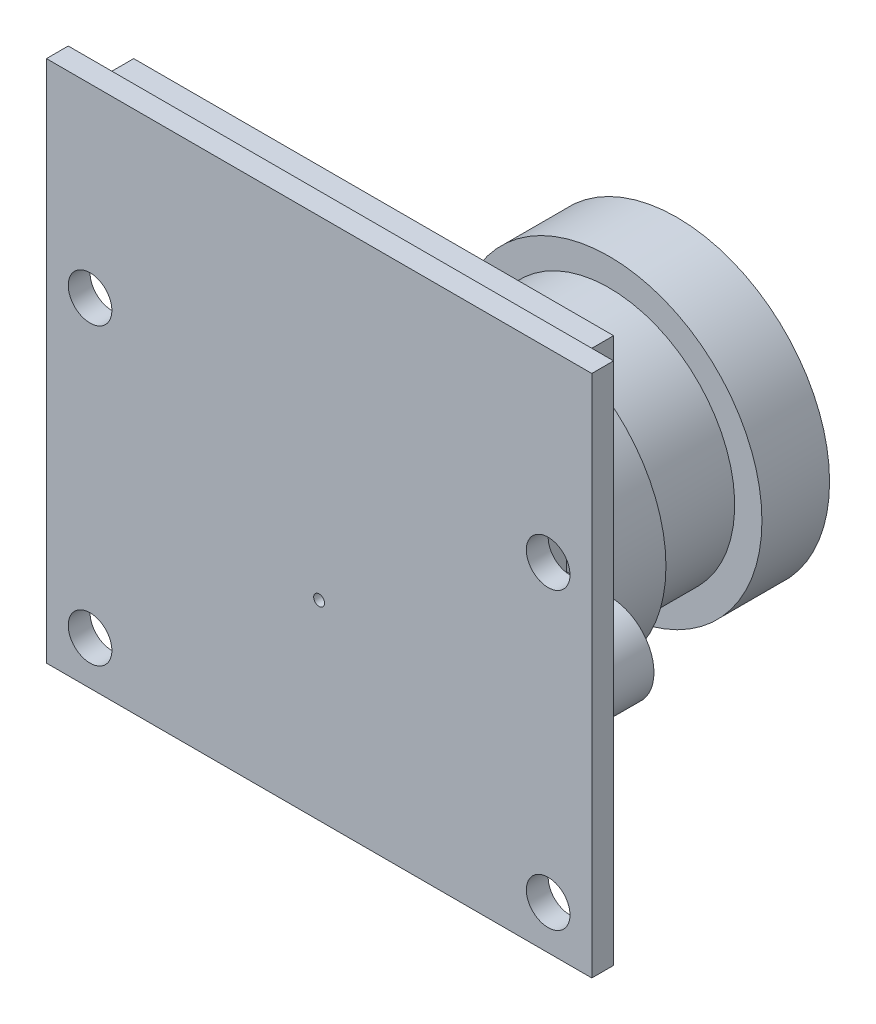
ISO-10303-21;
HEADER;
FILE_DESCRIPTION(('STEP AP214'),'2;1');
FILE_NAME('part.step','',(''),(''),'','','');
FILE_SCHEMA(('AUTOMOTIVE_DESIGN { 1 0 10303 214 1 1 1 1 }'));
ENDSEC;
DATA;
#1=APPLICATION_CONTEXT('core data for automotive mechanical design processes');
#2=APPLICATION_PROTOCOL_DEFINITION('international standard','automotive_design',2000,#1);
#3=PRODUCT_CONTEXT('',#1,'mechanical');
#4=PRODUCT('Part','Part','',(#3));
#5=PRODUCT_RELATED_PRODUCT_CATEGORY('part','',(#4));
#6=PRODUCT_DEFINITION_FORMATION('','',#4);
#7=PRODUCT_DEFINITION_CONTEXT('part definition',#1,'design');
#8=PRODUCT_DEFINITION('design','',#6,#7);
#9=PRODUCT_DEFINITION_SHAPE('','',#8);
#10=(LENGTH_UNIT() NAMED_UNIT(*) SI_UNIT(.MILLI.,.METRE.));
#11=(NAMED_UNIT(*) PLANE_ANGLE_UNIT() SI_UNIT($,.RADIAN.));
#12=(NAMED_UNIT(*) SI_UNIT($,.STERADIAN.) SOLID_ANGLE_UNIT());
#13=UNCERTAINTY_MEASURE_WITH_UNIT(LENGTH_MEASURE(1.E-05),#10,'distance_accuracy_value','');
#14=(GEOMETRIC_REPRESENTATION_CONTEXT(3) GLOBAL_UNCERTAINTY_ASSIGNED_CONTEXT((#13)) GLOBAL_UNIT_ASSIGNED_CONTEXT((#10,
#11,#12)) REPRESENTATION_CONTEXT('',''));
#15=CARTESIAN_POINT('',(0.,0.,0.));
#16=DIRECTION('',(0.,0.,1.));
#17=DIRECTION('',(1.,0.,0.));
#18=AXIS2_PLACEMENT_3D('',#15,#16,#17);
#19=CARTESIAN_POINT('',(3.94999511703025,8.74999999998993,-4.8));
#20=DIRECTION('',(0.,0.,1.));
#21=DIRECTION('',(1.,0.,0.));
#22=AXIS2_PLACEMENT_3D('',#19,#20,#21);
#23=PLANE('',#22);
#24=CARTESIAN_POINT('',(12.5,8.75,-4.8));
#25=DIRECTION('',(0.,0.,-1.));
#26=DIRECTION('',(-1.,0.,0.));
#27=AXIS2_PLACEMENT_3D('',#24,#25,#26);
#28=CIRCLE('',#27,6.6);
#29=CARTESIAN_POINT('',(13.3108637371741,15.2999999999798,-4.8));
#30=VERTEX_POINT('',#29);
#31=CARTESIAN_POINT('',(13.3108637368486,2.19999999997985,-4.8));
#32=VERTEX_POINT('',#31);
#33=EDGE_CURVE('E11',#30,#32,#28,.T.);
#34=ORIENTED_EDGE('',*,*,#33,.F.);
#35=DIRECTION('',(1.,0.,0.));
#36=VECTOR('',#35,1.);
#37=CARTESIAN_POINT('',(19.05,15.2999999999799,-4.8));
#38=LINE('',#37,#36);
#39=CARTESIAN_POINT('',(19.05,15.2999999999799,-4.8));
#40=VERTEX_POINT('',#39);
#41=EDGE_CURVE('E193',#30,#40,#38,.T.);
#42=ORIENTED_EDGE('',*,*,#41,.T.);
#43=DIRECTION('',(0.,-1.,0.));
#44=VECTOR('',#43,1.);
#45=CARTESIAN_POINT('',(19.05,10.75,-4.8));
#46=LINE('',#45,#44);
#47=CARTESIAN_POINT('',(19.05,10.75,-4.8));
#48=VERTEX_POINT('',#47);
#49=EDGE_CURVE('E190',#40,#48,#46,.T.);
#50=ORIENTED_EDGE('',*,*,#49,.T.);
#51=DIRECTION('',(1.,0.,0.));
#52=VECTOR('',#51,1.);
#53=CARTESIAN_POINT('',(21.0500097660236,10.75,-4.8));
#54=LINE('',#53,#52);
#55=CARTESIAN_POINT('',(21.0500097660236,10.75,-4.8));
#56=VERTEX_POINT('',#55);
#57=EDGE_CURVE('E246',#48,#56,#54,.T.);
#58=ORIENTED_EDGE('',*,*,#57,.T.);
#59=CARTESIAN_POINT('',(21.0500097660236,8.74999999998993,-4.8));
#60=DIRECTION('',(0.,0.,-1.));
#61=DIRECTION('',(1.,0.,0.));
#62=AXIS2_PLACEMENT_3D('',#59,#60,#61);
#63=CIRCLE('',#62,2.00000000001008);
#64=CARTESIAN_POINT('',(21.0500097660236,6.74999999997985,-4.8));
#65=VERTEX_POINT('',#64);
#66=EDGE_CURVE('E248',#56,#65,#63,.T.);
#67=ORIENTED_EDGE('',*,*,#66,.T.);
#68=DIRECTION('',(-1.,0.,0.));
#69=VECTOR('',#68,1.);
#70=CARTESIAN_POINT('',(19.05,6.74999999997985,-4.8));
#71=LINE('',#70,#69);
#72=CARTESIAN_POINT('',(19.05,6.74999999997985,-4.8));
#73=VERTEX_POINT('',#72);
#74=EDGE_CURVE('E250',#65,#73,#71,.T.);
#75=ORIENTED_EDGE('',*,*,#74,.T.);
#76=DIRECTION('',(0.,-1.,0.));
#77=VECTOR('',#76,1.);
#78=CARTESIAN_POINT('',(19.05,2.19999999997985,-4.8));
#79=LINE('',#78,#77);
#80=CARTESIAN_POINT('',(19.05,2.19999999997985,-4.8));
#81=VERTEX_POINT('',#80);
#82=EDGE_CURVE('E252',#73,#81,#79,.T.);
#83=ORIENTED_EDGE('',*,*,#82,.T.);
#84=DIRECTION('',(-1.,0.,0.));
#85=VECTOR('',#84,1.);
#86=CARTESIAN_POINT('',(5.95,2.19999999997985,-4.8));
#87=LINE('',#86,#85);
#88=EDGE_CURVE('E255',#81,#32,#87,.T.);
#89=ORIENTED_EDGE('',*,*,#88,.T.);
#90=EDGE_LOOP('',(#34,#42,#50,#58,#67,#75,#83,#89));
#91=FACE_BOUND('',#90,.T.);
#92=ADVANCED_FACE('F33',(#91),#23,.F.);
#93=CARTESIAN_POINT('',(0.,0.,-1.));
#94=DIRECTION('',(0.,0.,-1.));
#95=DIRECTION('',(-1.,0.,0.));
#96=AXIS2_PLACEMENT_3D('',#93,#94,#95);
#97=PLANE('',#96);
#98=CARTESIAN_POINT('',(2.,2.,-1.));
#99=DIRECTION('',(0.,0.,-1.));
#100=DIRECTION('',(-1.,0.,0.));
#101=AXIS2_PLACEMENT_3D('',#98,#99,#100);
#102=CIRCLE('',#101,0.999999999999986);
#103=CARTESIAN_POINT('',(1.00000000000001,2.,-1.));
#104=VERTEX_POINT('',#103);
#105=EDGE_CURVE('E777',#104,#104,#102,.T.);
#106=ORIENTED_EDGE('',*,*,#105,.F.);
#107=EDGE_LOOP('',(#106));
#108=FACE_BOUND('',#107,.T.);
#109=CARTESIAN_POINT('',(2.,15.5,-1.));
#110=DIRECTION('',(0.,0.,-1.));
#111=DIRECTION('',(-1.,0.,0.));
#112=AXIS2_PLACEMENT_3D('',#109,#110,#111);
#113=CIRCLE('',#112,0.999999999999986);
#114=CARTESIAN_POINT('',(1.00000000000001,15.5,-1.));
#115=VERTEX_POINT('',#114);
#116=EDGE_CURVE('E37',#115,#115,#113,.T.);
#117=ORIENTED_EDGE('',*,*,#116,.F.);
#118=EDGE_LOOP('',(#117));
#119=FACE_BOUND('',#118,.T.);
#120=CARTESIAN_POINT('',(23.,15.5,-1.));
#121=DIRECTION('',(0.,0.,-1.));
#122=DIRECTION('',(-1.,0.,0.));
#123=AXIS2_PLACEMENT_3D('',#120,#121,#122);
#124=CIRCLE('',#123,0.999999999999987);
#125=CARTESIAN_POINT('',(22.,15.5,-1.));
#126=VERTEX_POINT('',#125);
#127=EDGE_CURVE('E353',#126,#126,#124,.T.);
#128=ORIENTED_EDGE('',*,*,#127,.F.);
#129=EDGE_LOOP('',(#128));
#130=FACE_BOUND('',#129,.T.);
#131=CARTESIAN_POINT('',(23.,2.,-1.));
#132=DIRECTION('',(0.,0.,-1.));
#133=DIRECTION('',(-1.,0.,0.));
#134=AXIS2_PLACEMENT_3D('',#131,#132,#133);
#135=CIRCLE('',#134,0.999999999999987);
#136=CARTESIAN_POINT('',(22.,2.,-1.));
#137=VERTEX_POINT('',#136);
#138=EDGE_CURVE('E360',#137,#137,#135,.T.);
#139=ORIENTED_EDGE('',*,*,#138,.F.);
#140=EDGE_LOOP('',(#139));
#141=FACE_BOUND('',#140,.T.);
#142=DIRECTION('',(0.,-1.,0.));
#143=VECTOR('',#142,1.);
#144=CARTESIAN_POINT('',(25.,24.,-1.));
#145=LINE('',#144,#143);
#146=CARTESIAN_POINT('',(25.,24.,-1.));
#147=VERTEX_POINT('',#146);
#148=CARTESIAN_POINT('',(25.,0.,-1.));
#149=VERTEX_POINT('',#148);
#150=EDGE_CURVE('E323',#147,#149,#145,.T.);
#151=ORIENTED_EDGE('',*,*,#150,.T.);
#152=DIRECTION('',(-1.,0.,0.));
#153=VECTOR('',#152,1.);
#154=CARTESIAN_POINT('',(25.,0.,-1.));
#155=LINE('',#154,#153);
#156=CARTESIAN_POINT('',(0.,0.,-1.));
#157=VERTEX_POINT('',#156);
#158=EDGE_CURVE('E340',#149,#157,#155,.T.);
#159=ORIENTED_EDGE('',*,*,#158,.T.);
#160=DIRECTION('',(0.,1.,0.));
#161=VECTOR('',#160,1.);
#162=CARTESIAN_POINT('',(0.,0.,-1.));
#163=LINE('',#162,#161);
#164=CARTESIAN_POINT('',(0.,24.,-1.));
#165=VERTEX_POINT('',#164);
#166=EDGE_CURVE('E343',#157,#165,#163,.T.);
#167=ORIENTED_EDGE('',*,*,#166,.T.);
#168=DIRECTION('',(1.,0.,0.));
#169=VECTOR('',#168,1.);
#170=CARTESIAN_POINT('',(0.,24.,-1.));
#171=LINE('',#170,#169);
#172=EDGE_CURVE('E328',#165,#147,#171,.T.);
#173=ORIENTED_EDGE('',*,*,#172,.T.);
#174=EDGE_LOOP('',(#151,#159,#167,#173));
#175=FACE_BOUND('',#174,.T.);
#176=DIRECTION('',(1.,0.,0.));
#177=VECTOR('',#176,1.);
#178=CARTESIAN_POINT('',(19.05,15.2999999999799,-1.));
#179=LINE('',#178,#177);
#180=CARTESIAN_POINT('',(5.95,15.2999999999799,-1.));
#181=VERTEX_POINT('',#180);
#182=CARTESIAN_POINT('',(19.05,15.2999999999799,-1.));
#183=VERTEX_POINT('',#182);
#184=EDGE_CURVE('E268',#181,#183,#179,.T.);
#185=ORIENTED_EDGE('',*,*,#184,.F.);
#186=DIRECTION('',(0.,1.,0.));
#187=VECTOR('',#186,1.);
#188=CARTESIAN_POINT('',(5.95,15.2999999999799,-1.));
#189=LINE('',#188,#187);
#190=CARTESIAN_POINT('',(5.95,10.75,-1.));
#191=VERTEX_POINT('',#190);
#192=EDGE_CURVE('E242',#191,#181,#189,.T.);
#193=ORIENTED_EDGE('',*,*,#192,.F.);
#194=DIRECTION('',(1.,0.,0.));
#195=VECTOR('',#194,1.);
#196=CARTESIAN_POINT('',(5.95,10.75,-1.));
#197=LINE('',#196,#195);
#198=CARTESIAN_POINT('',(3.94999511703025,10.75,-1.));
#199=VERTEX_POINT('',#198);
#200=EDGE_CURVE('E243',#199,#191,#197,.T.);
#201=ORIENTED_EDGE('',*,*,#200,.F.);
#202=CARTESIAN_POINT('',(3.94999511703025,8.74999999998993,-1.));
#203=DIRECTION('',(0.,0.,-1.));
#204=DIRECTION('',(1.,0.,0.));
#205=AXIS2_PLACEMENT_3D('',#202,#203,#204);
#206=CIRCLE('',#205,2.00000000001007);
#207=CARTESIAN_POINT('',(3.94999511703025,6.74999999997985,-1.));
#208=VERTEX_POINT('',#207);
#209=EDGE_CURVE('E286',#208,#199,#206,.T.);
#210=ORIENTED_EDGE('',*,*,#209,.F.);
#211=DIRECTION('',(-1.,0.,0.));
#212=VECTOR('',#211,1.);
#213=CARTESIAN_POINT('',(3.94999511703025,6.74999999997985,-1.));
#214=LINE('',#213,#212);
#215=CARTESIAN_POINT('',(5.95,6.74999999997985,-1.));
#216=VERTEX_POINT('',#215);
#217=EDGE_CURVE('E284',#216,#208,#214,.T.);
#218=ORIENTED_EDGE('',*,*,#217,.F.);
#219=DIRECTION('',(0.,1.,0.));
#220=VECTOR('',#219,1.);
#221=CARTESIAN_POINT('',(5.95,6.74999999997985,-1.));
#222=LINE('',#221,#220);
#223=CARTESIAN_POINT('',(5.95,2.19999999997985,-1.));
#224=VERTEX_POINT('',#223);
#225=EDGE_CURVE('E282',#224,#216,#222,.T.);
#226=ORIENTED_EDGE('',*,*,#225,.F.);
#227=DIRECTION('',(-1.,0.,0.));
#228=VECTOR('',#227,1.);
#229=CARTESIAN_POINT('',(5.95,2.19999999997985,-1.));
#230=LINE('',#229,#228);
#231=CARTESIAN_POINT('',(19.05,2.19999999997985,-1.));
#232=VERTEX_POINT('',#231);
#233=EDGE_CURVE('E280',#232,#224,#230,.T.);
#234=ORIENTED_EDGE('',*,*,#233,.F.);
#235=DIRECTION('',(0.,-1.,0.));
#236=VECTOR('',#235,1.);
#237=CARTESIAN_POINT('',(19.05,2.19999999997985,-1.));
#238=LINE('',#237,#236);
#239=CARTESIAN_POINT('',(19.05,6.74999999997985,-1.));
#240=VERTEX_POINT('',#239);
#241=EDGE_CURVE('E278',#240,#232,#238,.T.);
#242=ORIENTED_EDGE('',*,*,#241,.F.);
#243=DIRECTION('',(-1.,0.,0.));
#244=VECTOR('',#243,1.);
#245=CARTESIAN_POINT('',(19.05,6.74999999997985,-1.));
#246=LINE('',#245,#244);
#247=CARTESIAN_POINT('',(21.0500097660236,6.74999999997985,-1.));
#248=VERTEX_POINT('',#247);
#249=EDGE_CURVE('E276',#248,#240,#246,.T.);
#250=ORIENTED_EDGE('',*,*,#249,.F.);
#251=CARTESIAN_POINT('',(21.0500097660236,8.74999999998993,-1.));
#252=DIRECTION('',(0.,0.,-1.));
#253=DIRECTION('',(1.,0.,0.));
#254=AXIS2_PLACEMENT_3D('',#251,#252,#253);
#255=CIRCLE('',#254,2.00000000001008);
#256=CARTESIAN_POINT('',(21.0500097660236,10.75,-1.));
#257=VERTEX_POINT('',#256);
#258=EDGE_CURVE('E274',#257,#248,#255,.T.);
#259=ORIENTED_EDGE('',*,*,#258,.F.);
#260=DIRECTION('',(1.,0.,0.));
#261=VECTOR('',#260,1.);
#262=CARTESIAN_POINT('',(21.0500097660236,10.75,-1.));
#263=LINE('',#262,#261);
#264=CARTESIAN_POINT('',(19.05,10.75,-1.));
#265=VERTEX_POINT('',#264);
#266=EDGE_CURVE('E272',#265,#257,#263,.T.);
#267=ORIENTED_EDGE('',*,*,#266,.F.);
#268=DIRECTION('',(0.,-1.,0.));
#269=VECTOR('',#268,1.);
#270=CARTESIAN_POINT('',(19.05,10.75,-1.));
#271=LINE('',#270,#269);
#272=EDGE_CURVE('E270',#183,#265,#271,.T.);
#273=ORIENTED_EDGE('',*,*,#272,.F.);
#274=EDGE_LOOP('',(#185,#193,#201,#210,#218,#226,#234,#242,#250,#259,#267,#273));
#275=FACE_BOUND('',#274,.T.);
#276=DIRECTION('',(0.,1.,0.));
#277=VECTOR('',#276,1.);
#278=CARTESIAN_POINT('',(1.5,23.5,-1.));
#279=LINE('',#278,#277);
#280=CARTESIAN_POINT('',(1.5,18.6977042974412,-1.));
#281=VERTEX_POINT('',#280);
#282=CARTESIAN_POINT('',(1.5,23.5,-1.));
#283=VERTEX_POINT('',#282);
#284=EDGE_CURVE('E211',#281,#283,#279,.T.);
#285=ORIENTED_EDGE('',*,*,#284,.F.);
#286=DIRECTION('',(-1.,0.,0.));
#287=VECTOR('',#286,1.);
#288=CARTESIAN_POINT('',(1.5,18.6977042974412,-1.));
#289=LINE('',#288,#287);
#290=CARTESIAN_POINT('',(23.5,18.6977042974412,-1.));
#291=VERTEX_POINT('',#290);
#292=EDGE_CURVE('E209',#291,#281,#289,.T.);
#293=ORIENTED_EDGE('',*,*,#292,.F.);
#294=DIRECTION('',(0.,-1.,0.));
#295=VECTOR('',#294,1.);
#296=CARTESIAN_POINT('',(23.5,18.6977042974412,-1.));
#297=LINE('',#296,#295);
#298=CARTESIAN_POINT('',(23.5,23.5,-1.));
#299=VERTEX_POINT('',#298);
#300=EDGE_CURVE('E221',#299,#291,#297,.T.);
#301=ORIENTED_EDGE('',*,*,#300,.F.);
#302=DIRECTION('',(1.,0.,0.));
#303=VECTOR('',#302,1.);
#304=CARTESIAN_POINT('',(23.5,23.5,-1.));
#305=LINE('',#304,#303);
#306=EDGE_CURVE('E229',#283,#299,#305,.T.);
#307=ORIENTED_EDGE('',*,*,#306,.F.);
#308=EDGE_LOOP('',(#285,#293,#301,#307));
#309=FACE_BOUND('',#308,.T.);
#310=ADVANCED_FACE('F410',(#108,#119,#130,#141,#175,#275,#309),#97,.T.);
#311=CARTESIAN_POINT('',(25.,24.,0.));
#312=DIRECTION('',(1.,0.,0.));
#313=DIRECTION('',(0.,0.,-1.));
#314=AXIS2_PLACEMENT_3D('',#311,#312,#313);
#315=PLANE('',#314);
#316=ORIENTED_EDGE('',*,*,#150,.F.);
#317=DIRECTION('',(0.,0.,-1.));
#318=VECTOR('',#317,1.);
#319=CARTESIAN_POINT('',(25.,24.,0.));
#320=LINE('',#319,#318);
#321=CARTESIAN_POINT('',(25.,24.,0.));
#322=VERTEX_POINT('',#321);
#323=EDGE_CURVE('E207',#322,#147,#320,.T.);
#324=ORIENTED_EDGE('',*,*,#323,.F.);
#325=DIRECTION('',(0.,-1.,0.));
#326=VECTOR('',#325,1.);
#327=CARTESIAN_POINT('',(25.,24.,0.));
#328=LINE('',#327,#326);
#329=CARTESIAN_POINT('',(25.,0.,0.));
#330=VERTEX_POINT('',#329);
#331=EDGE_CURVE('E324',#322,#330,#328,.T.);
#332=ORIENTED_EDGE('',*,*,#331,.T.);
#333=DIRECTION('',(0.,0.,-1.));
#334=VECTOR('',#333,1.);
#335=CARTESIAN_POINT('',(25.,0.,0.));
#336=LINE('',#335,#334);
#337=EDGE_CURVE('E337',#330,#149,#336,.T.);
#338=ORIENTED_EDGE('',*,*,#337,.T.);
#339=EDGE_LOOP('',(#316,#324,#332,#338));
#340=FACE_BOUND('',#339,.T.);
#341=ADVANCED_FACE('F35',(#340),#315,.T.);
#342=CARTESIAN_POINT('',(0.,24.,0.));
#343=DIRECTION('',(0.,1.,0.));
#344=DIRECTION('',(0.,0.,1.));
#345=AXIS2_PLACEMENT_3D('',#342,#343,#344);
#346=PLANE('',#345);
#347=ORIENTED_EDGE('',*,*,#172,.F.);
#348=DIRECTION('',(0.,0.,-1.));
#349=VECTOR('',#348,1.);
#350=CARTESIAN_POINT('',(0.,24.,0.));
#351=LINE('',#350,#349);
#352=CARTESIAN_POINT('',(0.,24.,0.));
#353=VERTEX_POINT('',#352);
#354=EDGE_CURVE('E349',#353,#165,#351,.T.);
#355=ORIENTED_EDGE('',*,*,#354,.F.);
#356=DIRECTION('',(1.,0.,0.));
#357=VECTOR('',#356,1.);
#358=CARTESIAN_POINT('',(0.,24.,0.));
#359=LINE('',#358,#357);
#360=EDGE_CURVE('E334',#353,#322,#359,.T.);
#361=ORIENTED_EDGE('',*,*,#360,.T.);
#362=ORIENTED_EDGE('',*,*,#323,.T.);
#363=EDGE_LOOP('',(#347,#355,#361,#362));
#364=FACE_BOUND('',#363,.T.);
#365=ADVANCED_FACE('F479',(#364),#346,.T.);
#366=CARTESIAN_POINT('',(0.,0.,0.));
#367=DIRECTION('',(-1.,0.,0.));
#368=DIRECTION('',(0.,0.,1.));
#369=AXIS2_PLACEMENT_3D('',#366,#367,#368);
#370=PLANE('',#369);
#371=ORIENTED_EDGE('',*,*,#166,.F.);
#372=DIRECTION('',(0.,0.,-1.));
#373=VECTOR('',#372,1.);
#374=CARTESIAN_POINT('',(0.,0.,0.));
#375=LINE('',#374,#373);
#376=CARTESIAN_POINT('',(0.,0.,0.));
#377=VERTEX_POINT('',#376);
#378=EDGE_CURVE('E351',#377,#157,#375,.T.);
#379=ORIENTED_EDGE('',*,*,#378,.F.);
#380=DIRECTION('',(0.,1.,0.));
#381=VECTOR('',#380,1.);
#382=CARTESIAN_POINT('',(0.,0.,0.));
#383=LINE('',#382,#381);
#384=EDGE_CURVE('E331',#377,#353,#383,.T.);
#385=ORIENTED_EDGE('',*,*,#384,.T.);
#386=ORIENTED_EDGE('',*,*,#354,.T.);
#387=EDGE_LOOP('',(#371,#379,#385,#386));
#388=FACE_BOUND('',#387,.T.);
#389=ADVANCED_FACE('F482',(#388),#370,.T.);
#390=CARTESIAN_POINT('',(25.,0.,0.));
#391=DIRECTION('',(0.,-1.,0.));
#392=DIRECTION('',(0.,0.,-1.));
#393=AXIS2_PLACEMENT_3D('',#390,#391,#392);
#394=PLANE('',#393);
#395=ORIENTED_EDGE('',*,*,#158,.F.);
#396=ORIENTED_EDGE('',*,*,#337,.F.);
#397=DIRECTION('',(-1.,0.,0.));
#398=VECTOR('',#397,1.);
#399=CARTESIAN_POINT('',(25.,0.,0.));
#400=LINE('',#399,#398);
#401=EDGE_CURVE('E327',#330,#377,#400,.T.);
#402=ORIENTED_EDGE('',*,*,#401,.T.);
#403=ORIENTED_EDGE('',*,*,#378,.T.);
#404=EDGE_LOOP('',(#395,#396,#402,#403));
#405=FACE_BOUND('',#404,.T.);
#406=ADVANCED_FACE('F476',(#405),#394,.T.);
#407=CARTESIAN_POINT('',(0.,0.,0.));
#408=DIRECTION('',(0.,0.,-1.));
#409=DIRECTION('',(-1.,0.,0.));
#410=AXIS2_PLACEMENT_3D('',#407,#408,#409);
#411=PLANE('',#410);
#412=CARTESIAN_POINT('',(2.,2.,0.));
#413=DIRECTION('',(0.,0.,1.));
#414=DIRECTION('',(1.,0.,0.));
#415=AXIS2_PLACEMENT_3D('',#412,#413,#414);
#416=CIRCLE('',#415,0.999999999999987);
#417=CARTESIAN_POINT('',(2.99999999999999,2.,0.));
#418=VERTEX_POINT('',#417);
#419=EDGE_CURVE('E780',#418,#418,#416,.T.);
#420=ORIENTED_EDGE('',*,*,#419,.F.);
#421=EDGE_LOOP('',(#420));
#422=FACE_BOUND('',#421,.T.);
#423=CARTESIAN_POINT('',(2.,15.5,0.));
#424=DIRECTION('',(0.,0.,1.));
#425=DIRECTION('',(1.,0.,0.));
#426=AXIS2_PLACEMENT_3D('',#423,#424,#425);
#427=CIRCLE('',#426,0.999999999999987);
#428=CARTESIAN_POINT('',(2.99999999999999,15.5,0.));
#429=VERTEX_POINT('',#428);
#430=EDGE_CURVE('E367',#429,#429,#427,.T.);
#431=ORIENTED_EDGE('',*,*,#430,.F.);
#432=EDGE_LOOP('',(#431));
#433=FACE_BOUND('',#432,.T.);
#434=CARTESIAN_POINT('',(23.,15.5,0.));
#435=DIRECTION('',(0.,0.,1.));
#436=DIRECTION('',(1.,0.,0.));
#437=AXIS2_PLACEMENT_3D('',#434,#435,#436);
#438=CIRCLE('',#437,0.999999999999987);
#439=CARTESIAN_POINT('',(24.,15.5,0.));
#440=VERTEX_POINT('',#439);
#441=EDGE_CURVE('E356',#440,#440,#438,.T.);
#442=ORIENTED_EDGE('',*,*,#441,.F.);
#443=EDGE_LOOP('',(#442));
#444=FACE_BOUND('',#443,.T.);
#445=CARTESIAN_POINT('',(23.,2.,0.));
#446=DIRECTION('',(0.,0.,1.));
#447=DIRECTION('',(1.,0.,0.));
#448=AXIS2_PLACEMENT_3D('',#445,#446,#447);
#449=CIRCLE('',#448,0.999999999999987);
#450=CARTESIAN_POINT('',(24.,2.,0.));
#451=VERTEX_POINT('',#450);
#452=EDGE_CURVE('E355',#451,#451,#449,.T.);
#453=ORIENTED_EDGE('',*,*,#452,.F.);
#454=EDGE_LOOP('',(#453));
#455=FACE_BOUND('',#454,.T.);
#456=CARTESIAN_POINT('',(12.5,8.75,0.));
#457=DIRECTION('',(0.,0.,1.));
#458=DIRECTION('',(1.,0.,0.));
#459=AXIS2_PLACEMENT_3D('',#456,#457,#458);
#460=CIRCLE('',#459,0.24999999999999);
#461=CARTESIAN_POINT('',(12.75,8.75,0.));
#462=VERTEX_POINT('',#461);
#463=EDGE_CURVE('E373',#462,#462,#460,.T.);
#464=ORIENTED_EDGE('',*,*,#463,.F.);
#465=EDGE_LOOP('',(#464));
#466=FACE_BOUND('',#465,.T.);
#467=ORIENTED_EDGE('',*,*,#331,.F.);
#468=ORIENTED_EDGE('',*,*,#360,.F.);
#469=ORIENTED_EDGE('',*,*,#384,.F.);
#470=ORIENTED_EDGE('',*,*,#401,.F.);
#471=EDGE_LOOP('',(#467,#468,#469,#470));
#472=FACE_BOUND('',#471,.T.);
#473=ADVANCED_FACE('F473',(#422,#433,#444,#455,#466,#472),#411,.F.);
#474=CARTESIAN_POINT('',(5.95,15.2999999999799,-4.8));
#475=DIRECTION('',(1.,0.,0.));
#476=DIRECTION('',(0.,0.,-1.));
#477=AXIS2_PLACEMENT_3D('',#474,#475,#476);
#478=PLANE('',#477);
#479=ORIENTED_EDGE('',*,*,#192,.T.);
#480=DIRECTION('',(0.,0.,1.));
#481=VECTOR('',#480,1.);
#482=CARTESIAN_POINT('',(5.95,15.2999999999799,-4.8));
#483=LINE('',#482,#481);
#484=CARTESIAN_POINT('',(5.95,15.2999999999799,-4.8));
#485=VERTEX_POINT('',#484);
#486=EDGE_CURVE('E321',#485,#181,#483,.T.);
#487=ORIENTED_EDGE('',*,*,#486,.F.);
#488=DIRECTION('',(0.,1.,0.));
#489=VECTOR('',#488,1.);
#490=CARTESIAN_POINT('',(5.95,15.2999999999799,-4.8));
#491=LINE('',#490,#489);
#492=CARTESIAN_POINT('',(5.95,10.75,-4.8));
#493=VERTEX_POINT('',#492);
#494=EDGE_CURVE('E187',#493,#485,#491,.T.);
#495=ORIENTED_EDGE('',*,*,#494,.F.);
#496=DIRECTION('',(0.,0.,1.));
#497=VECTOR('',#496,1.);
#498=CARTESIAN_POINT('',(5.95,10.75,-4.8));
#499=LINE('',#498,#497);
#500=EDGE_CURVE('E265',#493,#191,#499,.T.);
#501=ORIENTED_EDGE('',*,*,#500,.T.);
#502=EDGE_LOOP('',(#479,#487,#495,#501));
#503=FACE_BOUND('',#502,.T.);
#504=ADVANCED_FACE('F470',(#503),#478,.F.);
#505=CARTESIAN_POINT('',(19.05,15.2999999999799,-4.8));
#506=DIRECTION('',(0.,-1.,0.));
#507=DIRECTION('',(0.,0.,-1.));
#508=AXIS2_PLACEMENT_3D('',#505,#506,#507);
#509=PLANE('',#508);
#510=ORIENTED_EDGE('',*,*,#184,.T.);
#511=DIRECTION('',(0.,0.,1.));
#512=VECTOR('',#511,1.);
#513=CARTESIAN_POINT('',(19.05,15.2999999999799,-4.8));
#514=LINE('',#513,#512);
#515=EDGE_CURVE('E318',#40,#183,#514,.T.);
#516=ORIENTED_EDGE('',*,*,#515,.F.);
#517=ORIENTED_EDGE('',*,*,#41,.F.);
#518=CARTESIAN_POINT('',(11.6891362628259,15.2999999999798,-4.8));
#519=VERTEX_POINT('',#518);
#520=EDGE_CURVE('E191',#519,#30,#38,.T.);
#521=ORIENTED_EDGE('',*,*,#520,.F.);
#522=EDGE_CURVE('E183',#485,#519,#38,.T.);
#523=ORIENTED_EDGE('',*,*,#522,.F.);
#524=ORIENTED_EDGE('',*,*,#486,.T.);
#525=EDGE_LOOP('',(#510,#516,#517,#521,#523,#524));
#526=FACE_BOUND('',#525,.T.);
#527=ADVANCED_FACE('F196',(#526),#509,.F.);
#528=CARTESIAN_POINT('',(19.05,10.75,-4.8));
#529=DIRECTION('',(-1.,0.,0.));
#530=DIRECTION('',(0.,0.,1.));
#531=AXIS2_PLACEMENT_3D('',#528,#529,#530);
#532=PLANE('',#531);
#533=ORIENTED_EDGE('',*,*,#272,.T.);
#534=DIRECTION('',(0.,0.,1.));
#535=VECTOR('',#534,1.);
#536=CARTESIAN_POINT('',(19.05,10.75,-4.8));
#537=LINE('',#536,#535);
#538=EDGE_CURVE('E315',#48,#265,#537,.T.);
#539=ORIENTED_EDGE('',*,*,#538,.F.);
#540=ORIENTED_EDGE('',*,*,#49,.F.);
#541=ORIENTED_EDGE('',*,*,#515,.T.);
#542=EDGE_LOOP('',(#533,#539,#540,#541));
#543=FACE_BOUND('',#542,.T.);
#544=ADVANCED_FACE('F463',(#543),#532,.F.);
#545=CARTESIAN_POINT('',(21.0500097660236,10.75,-4.8));
#546=DIRECTION('',(0.,-1.,0.));
#547=DIRECTION('',(1.,0.,0.));
#548=AXIS2_PLACEMENT_3D('',#545,#546,#547);
#549=PLANE('',#548);
#550=ORIENTED_EDGE('',*,*,#266,.T.);
#551=DIRECTION('',(0.,0.,1.));
#552=VECTOR('',#551,1.);
#553=CARTESIAN_POINT('',(21.0500097660236,10.75,-4.8));
#554=LINE('',#553,#552);
#555=EDGE_CURVE('E312',#56,#257,#554,.T.);
#556=ORIENTED_EDGE('',*,*,#555,.F.);
#557=ORIENTED_EDGE('',*,*,#57,.F.);
#558=ORIENTED_EDGE('',*,*,#538,.T.);
#559=EDGE_LOOP('',(#550,#556,#557,#558));
#560=FACE_BOUND('',#559,.T.);
#561=ADVANCED_FACE('F459',(#560),#549,.F.);
#562=CARTESIAN_POINT('',(21.0500097660236,8.74999999998993,-4.8));
#563=DIRECTION('',(0.,0.,1.));
#564=DIRECTION('',(1.,0.,0.));
#565=AXIS2_PLACEMENT_3D('',#562,#563,#564);
#566=CYLINDRICAL_SURFACE('',#565,2.00000000001008);
#567=ORIENTED_EDGE('',*,*,#258,.T.);
#568=DIRECTION('',(0.,0.,1.));
#569=VECTOR('',#568,1.);
#570=CARTESIAN_POINT('',(21.0500097660236,6.74999999997985,-4.8));
#571=LINE('',#570,#569);
#572=EDGE_CURVE('E309',#65,#248,#571,.T.);
#573=ORIENTED_EDGE('',*,*,#572,.F.);
#574=ORIENTED_EDGE('',*,*,#66,.F.);
#575=ORIENTED_EDGE('',*,*,#555,.T.);
#576=EDGE_LOOP('',(#567,#573,#574,#575));
#577=FACE_BOUND('',#576,.T.);
#578=ADVANCED_FACE('F455',(#577),#566,.T.);
#579=CARTESIAN_POINT('',(19.05,6.74999999997985,-4.8));
#580=DIRECTION('',(0.,1.,0.));
#581=DIRECTION('',(-1.,0.,0.));
#582=AXIS2_PLACEMENT_3D('',#579,#580,#581);
#583=PLANE('',#582);
#584=ORIENTED_EDGE('',*,*,#249,.T.);
#585=DIRECTION('',(0.,0.,1.));
#586=VECTOR('',#585,1.);
#587=CARTESIAN_POINT('',(19.05,6.74999999997985,-4.8));
#588=LINE('',#587,#586);
#589=EDGE_CURVE('E306',#73,#240,#588,.T.);
#590=ORIENTED_EDGE('',*,*,#589,.F.);
#591=ORIENTED_EDGE('',*,*,#74,.F.);
#592=ORIENTED_EDGE('',*,*,#572,.T.);
#593=EDGE_LOOP('',(#584,#590,#591,#592));
#594=FACE_BOUND('',#593,.T.);
#595=ADVANCED_FACE('F451',(#594),#583,.F.);
#596=CARTESIAN_POINT('',(19.05,2.19999999997985,-4.8));
#597=DIRECTION('',(-1.,0.,0.));
#598=DIRECTION('',(0.,0.,1.));
#599=AXIS2_PLACEMENT_3D('',#596,#597,#598);
#600=PLANE('',#599);
#601=ORIENTED_EDGE('',*,*,#241,.T.);
#602=DIRECTION('',(0.,0.,1.));
#603=VECTOR('',#602,1.);
#604=CARTESIAN_POINT('',(19.05,2.19999999997985,-4.8));
#605=LINE('',#604,#603);
#606=EDGE_CURVE('E303',#81,#232,#605,.T.);
#607=ORIENTED_EDGE('',*,*,#606,.F.);
#608=ORIENTED_EDGE('',*,*,#82,.F.);
#609=ORIENTED_EDGE('',*,*,#589,.T.);
#610=EDGE_LOOP('',(#601,#607,#608,#609));
#611=FACE_BOUND('',#610,.T.);
#612=ADVANCED_FACE('F448',(#611),#600,.F.);
#613=CARTESIAN_POINT('',(5.95,2.19999999997985,-4.8));
#614=DIRECTION('',(0.,1.,0.));
#615=DIRECTION('',(-1.,0.,0.));
#616=AXIS2_PLACEMENT_3D('',#613,#614,#615);
#617=PLANE('',#616);
#618=ORIENTED_EDGE('',*,*,#233,.T.);
#619=DIRECTION('',(0.,0.,1.));
#620=VECTOR('',#619,1.);
#621=CARTESIAN_POINT('',(5.95,2.19999999997985,-4.8));
#622=LINE('',#621,#620);
#623=CARTESIAN_POINT('',(5.95,2.19999999997985,-4.8));
#624=VERTEX_POINT('',#623);
#625=EDGE_CURVE('E300',#624,#224,#622,.T.);
#626=ORIENTED_EDGE('',*,*,#625,.F.);
#627=CARTESIAN_POINT('',(11.6891362631514,2.19999999997985,-4.8));
#628=VERTEX_POINT('',#627);
#629=EDGE_CURVE('E254',#628,#624,#87,.T.);
#630=ORIENTED_EDGE('',*,*,#629,.F.);
#631=EDGE_CURVE('E57',#32,#628,#87,.T.);
#632=ORIENTED_EDGE('',*,*,#631,.F.);
#633=ORIENTED_EDGE('',*,*,#88,.F.);
#634=ORIENTED_EDGE('',*,*,#606,.T.);
#635=EDGE_LOOP('',(#618,#626,#630,#632,#633,#634));
#636=FACE_BOUND('',#635,.T.);
#637=ADVANCED_FACE('F444',(#636),#617,.F.);
#638=CARTESIAN_POINT('',(5.95,6.74999999997985,-4.8));
#639=DIRECTION('',(1.,0.,0.));
#640=DIRECTION('',(0.,0.,-1.));
#641=AXIS2_PLACEMENT_3D('',#638,#639,#640);
#642=PLANE('',#641);
#643=ORIENTED_EDGE('',*,*,#225,.T.);
#644=DIRECTION('',(0.,0.,1.));
#645=VECTOR('',#644,1.);
#646=CARTESIAN_POINT('',(5.95,6.74999999997985,-4.8));
#647=LINE('',#646,#645);
#648=CARTESIAN_POINT('',(5.95,6.74999999997985,-4.8));
#649=VERTEX_POINT('',#648);
#650=EDGE_CURVE('E297',#649,#216,#647,.T.);
#651=ORIENTED_EDGE('',*,*,#650,.F.);
#652=DIRECTION('',(0.,1.,0.));
#653=VECTOR('',#652,1.);
#654=CARTESIAN_POINT('',(5.95,6.74999999997985,-4.8));
#655=LINE('',#654,#653);
#656=EDGE_CURVE('E257',#624,#649,#655,.T.);
#657=ORIENTED_EDGE('',*,*,#656,.F.);
#658=ORIENTED_EDGE('',*,*,#625,.T.);
#659=EDGE_LOOP('',(#643,#651,#657,#658));
#660=FACE_BOUND('',#659,.T.);
#661=ADVANCED_FACE('F440',(#660),#642,.F.);
#662=CARTESIAN_POINT('',(3.94999511703025,6.74999999997985,-4.8));
#663=DIRECTION('',(0.,1.,0.));
#664=DIRECTION('',(-1.,0.,0.));
#665=AXIS2_PLACEMENT_3D('',#662,#663,#664);
#666=PLANE('',#665);
#667=ORIENTED_EDGE('',*,*,#217,.T.);
#668=DIRECTION('',(0.,0.,1.));
#669=VECTOR('',#668,1.);
#670=CARTESIAN_POINT('',(3.94999511703025,6.74999999997985,-4.8));
#671=LINE('',#670,#669);
#672=CARTESIAN_POINT('',(3.94999511703025,6.74999999997985,-4.8));
#673=VERTEX_POINT('',#672);
#674=EDGE_CURVE('E294',#673,#208,#671,.T.);
#675=ORIENTED_EDGE('',*,*,#674,.F.);
#676=DIRECTION('',(-1.,0.,0.));
#677=VECTOR('',#676,1.);
#678=CARTESIAN_POINT('',(3.94999511703025,6.74999999997985,-4.8));
#679=LINE('',#678,#677);
#680=EDGE_CURVE('E259',#649,#673,#679,.T.);
#681=ORIENTED_EDGE('',*,*,#680,.F.);
#682=ORIENTED_EDGE('',*,*,#650,.T.);
#683=EDGE_LOOP('',(#667,#675,#681,#682));
#684=FACE_BOUND('',#683,.T.);
#685=ADVANCED_FACE('F434',(#684),#666,.F.);
#686=CARTESIAN_POINT('',(3.94999511703025,8.74999999998993,-4.8));
#687=DIRECTION('',(0.,0.,1.));
#688=DIRECTION('',(1.,0.,0.));
#689=AXIS2_PLACEMENT_3D('',#686,#687,#688);
#690=CYLINDRICAL_SURFACE('',#689,2.00000000001007);
#691=ORIENTED_EDGE('',*,*,#209,.T.);
#692=DIRECTION('',(0.,0.,1.));
#693=VECTOR('',#692,1.);
#694=CARTESIAN_POINT('',(3.94999511703025,10.75,-4.8));
#695=LINE('',#694,#693);
#696=CARTESIAN_POINT('',(3.94999511703025,10.75,-4.8));
#697=VERTEX_POINT('',#696);
#698=EDGE_CURVE('E292',#697,#199,#695,.T.);
#699=ORIENTED_EDGE('',*,*,#698,.F.);
#700=CARTESIAN_POINT('',(3.94999511703025,8.74999999998993,-4.8));
#701=DIRECTION('',(0.,0.,-1.));
#702=DIRECTION('',(1.,0.,0.));
#703=AXIS2_PLACEMENT_3D('',#700,#701,#702);
#704=CIRCLE('',#703,2.00000000001007);
#705=EDGE_CURVE('E261',#673,#697,#704,.T.);
#706=ORIENTED_EDGE('',*,*,#705,.F.);
#707=ORIENTED_EDGE('',*,*,#674,.T.);
#708=EDGE_LOOP('',(#691,#699,#706,#707));
#709=FACE_BOUND('',#708,.T.);
#710=ADVANCED_FACE('F429',(#709),#690,.T.);
#711=CARTESIAN_POINT('',(5.95,10.75,-4.8));
#712=DIRECTION('',(0.,-1.,0.));
#713=DIRECTION('',(1.,0.,0.));
#714=AXIS2_PLACEMENT_3D('',#711,#712,#713);
#715=PLANE('',#714);
#716=ORIENTED_EDGE('',*,*,#200,.T.);
#717=ORIENTED_EDGE('',*,*,#500,.F.);
#718=DIRECTION('',(1.,0.,0.));
#719=VECTOR('',#718,1.);
#720=CARTESIAN_POINT('',(5.95,10.75,-4.8));
#721=LINE('',#720,#719);
#722=EDGE_CURVE('E263',#697,#493,#721,.T.);
#723=ORIENTED_EDGE('',*,*,#722,.F.);
#724=ORIENTED_EDGE('',*,*,#698,.T.);
#725=EDGE_LOOP('',(#716,#717,#723,#724));
#726=FACE_BOUND('',#725,.T.);
#727=ADVANCED_FACE('F422',(#726),#715,.F.);
#728=EDGE_CURVE('E42',#628,#519,#28,.T.);
#729=ORIENTED_EDGE('',*,*,#728,.F.);
#730=ORIENTED_EDGE('',*,*,#629,.T.);
#731=ORIENTED_EDGE('',*,*,#656,.T.);
#732=ORIENTED_EDGE('',*,*,#680,.T.);
#733=ORIENTED_EDGE('',*,*,#705,.T.);
#734=ORIENTED_EDGE('',*,*,#722,.T.);
#735=ORIENTED_EDGE('',*,*,#494,.T.);
#736=ORIENTED_EDGE('',*,*,#522,.T.);
#737=EDGE_LOOP('',(#729,#730,#731,#732,#733,#734,#735,#736));
#738=FACE_BOUND('',#737,.T.);
#739=ADVANCED_FACE('F185',(#738),#23,.F.);
#740=CARTESIAN_POINT('',(1.5,18.6977042974412,-2.5));
#741=DIRECTION('',(0.,1.,0.));
#742=DIRECTION('',(0.,0.,1.));
#743=AXIS2_PLACEMENT_3D('',#740,#741,#742);
#744=PLANE('',#743);
#745=ORIENTED_EDGE('',*,*,#292,.T.);
#746=DIRECTION('',(0.,0.,1.));
#747=VECTOR('',#746,1.);
#748=CARTESIAN_POINT('',(1.5,18.6977042974412,-2.5));
#749=LINE('',#748,#747);
#750=CARTESIAN_POINT('',(1.5,18.6977042974412,-2.5));
#751=VERTEX_POINT('',#750);
#752=EDGE_CURVE('E240',#751,#281,#749,.T.);
#753=ORIENTED_EDGE('',*,*,#752,.F.);
#754=DIRECTION('',(-1.,0.,0.));
#755=VECTOR('',#754,1.);
#756=CARTESIAN_POINT('',(1.5,18.6977042974412,-2.5));
#757=LINE('',#756,#755);
#758=CARTESIAN_POINT('',(23.5,18.6977042974412,-2.5));
#759=VERTEX_POINT('',#758);
#760=EDGE_CURVE('E217',#759,#751,#757,.T.);
#761=ORIENTED_EDGE('',*,*,#760,.F.);
#762=DIRECTION('',(0.,0.,1.));
#763=VECTOR('',#762,1.);
#764=CARTESIAN_POINT('',(23.5,18.6977042974412,-2.5));
#765=LINE('',#764,#763);
#766=EDGE_CURVE('E226',#759,#291,#765,.T.);
#767=ORIENTED_EDGE('',*,*,#766,.T.);
#768=EDGE_LOOP('',(#745,#753,#761,#767));
#769=FACE_BOUND('',#768,.T.);
#770=ADVANCED_FACE('F421',(#769),#744,.F.);
#771=CARTESIAN_POINT('',(1.5,23.5,-2.5));
#772=DIRECTION('',(1.,0.,0.));
#773=DIRECTION('',(0.,1.,0.));
#774=AXIS2_PLACEMENT_3D('',#771,#772,#773);
#775=PLANE('',#774);
#776=ORIENTED_EDGE('',*,*,#284,.T.);
#777=DIRECTION('',(0.,0.,1.));
#778=VECTOR('',#777,1.);
#779=CARTESIAN_POINT('',(1.5,23.5,-2.5));
#780=LINE('',#779,#778);
#781=CARTESIAN_POINT('',(1.5,23.5,-2.5));
#782=VERTEX_POINT('',#781);
#783=EDGE_CURVE('E237',#782,#283,#780,.T.);
#784=ORIENTED_EDGE('',*,*,#783,.F.);
#785=DIRECTION('',(0.,1.,0.));
#786=VECTOR('',#785,1.);
#787=CARTESIAN_POINT('',(1.5,23.5,-2.5));
#788=LINE('',#787,#786);
#789=EDGE_CURVE('E220',#751,#782,#788,.T.);
#790=ORIENTED_EDGE('',*,*,#789,.F.);
#791=ORIENTED_EDGE('',*,*,#752,.T.);
#792=EDGE_LOOP('',(#776,#784,#790,#791));
#793=FACE_BOUND('',#792,.T.);
#794=ADVANCED_FACE('F427',(#793),#775,.F.);
#795=CARTESIAN_POINT('',(23.5,23.5,-2.5));
#796=DIRECTION('',(0.,-1.,0.));
#797=DIRECTION('',(0.,0.,-1.));
#798=AXIS2_PLACEMENT_3D('',#795,#796,#797);
#799=PLANE('',#798);
#800=ORIENTED_EDGE('',*,*,#306,.T.);
#801=DIRECTION('',(0.,0.,1.));
#802=VECTOR('',#801,1.);
#803=CARTESIAN_POINT('',(23.5,23.5,-2.5));
#804=LINE('',#803,#802);
#805=CARTESIAN_POINT('',(23.5,23.5,-2.5));
#806=VERTEX_POINT('',#805);
#807=EDGE_CURVE('E235',#806,#299,#804,.T.);
#808=ORIENTED_EDGE('',*,*,#807,.F.);
#809=DIRECTION('',(1.,0.,0.));
#810=VECTOR('',#809,1.);
#811=CARTESIAN_POINT('',(23.5,23.5,-2.5));
#812=LINE('',#811,#810);
#813=EDGE_CURVE('E223',#782,#806,#812,.T.);
#814=ORIENTED_EDGE('',*,*,#813,.F.);
#815=ORIENTED_EDGE('',*,*,#783,.T.);
#816=EDGE_LOOP('',(#800,#808,#814,#815));
#817=FACE_BOUND('',#816,.T.);
#818=ADVANCED_FACE('F597',(#817),#799,.F.);
#819=CARTESIAN_POINT('',(23.5,18.6977042974412,-2.5));
#820=DIRECTION('',(-1.,0.,0.));
#821=DIRECTION('',(0.,0.,1.));
#822=AXIS2_PLACEMENT_3D('',#819,#820,#821);
#823=PLANE('',#822);
#824=ORIENTED_EDGE('',*,*,#300,.T.);
#825=ORIENTED_EDGE('',*,*,#766,.F.);
#826=DIRECTION('',(0.,-1.,0.));
#827=VECTOR('',#826,1.);
#828=CARTESIAN_POINT('',(23.5,18.6977042974412,-2.5));
#829=LINE('',#828,#827);
#830=EDGE_CURVE('E225',#806,#759,#829,.T.);
#831=ORIENTED_EDGE('',*,*,#830,.F.);
#832=ORIENTED_EDGE('',*,*,#807,.T.);
#833=EDGE_LOOP('',(#824,#825,#831,#832));
#834=FACE_BOUND('',#833,.T.);
#835=ADVANCED_FACE('F607',(#834),#823,.F.);
#836=CARTESIAN_POINT('',(0.,0.,-2.5));
#837=DIRECTION('',(0.,0.,1.));
#838=DIRECTION('',(1.,0.,0.));
#839=AXIS2_PLACEMENT_3D('',#836,#837,#838);
#840=PLANE('',#839);
#841=ORIENTED_EDGE('',*,*,#760,.T.);
#842=ORIENTED_EDGE('',*,*,#789,.T.);
#843=ORIENTED_EDGE('',*,*,#813,.T.);
#844=ORIENTED_EDGE('',*,*,#830,.T.);
#845=EDGE_LOOP('',(#841,#842,#843,#844));
#846=FACE_BOUND('',#845,.T.);
#847=ADVANCED_FACE('F617',(#846),#840,.F.);
#848=CARTESIAN_POINT('',(19.1,8.75,-4.8));
#849=DIRECTION('',(0.,0.,1.));
#850=DIRECTION('',(1.,0.,0.));
#851=AXIS2_PLACEMENT_3D('',#848,#849,#850);
#852=PLANE('',#851);
#853=EDGE_CURVE('E205',#519,#30,#28,.T.);
#854=ORIENTED_EDGE('',*,*,#853,.F.);
#855=ORIENTED_EDGE('',*,*,#520,.T.);
#856=EDGE_LOOP('',(#854,#855));
#857=FACE_BOUND('',#856,.T.);
#858=ADVANCED_FACE('F208',(#857),#852,.T.);
#859=CARTESIAN_POINT('',(12.5,8.75,-4.8));
#860=DIRECTION('',(0.,0.,-1.));
#861=DIRECTION('',(-1.,0.,0.));
#862=AXIS2_PLACEMENT_3D('',#859,#860,#861);
#863=CYLINDRICAL_SURFACE('',#862,6.6);
#864=ORIENTED_EDGE('',*,*,#853,.T.);
#865=ORIENTED_EDGE('',*,*,#33,.T.);
#866=EDGE_CURVE('E44',#32,#628,#28,.T.);
#867=ORIENTED_EDGE('',*,*,#866,.T.);
#868=ORIENTED_EDGE('',*,*,#728,.T.);
#869=EDGE_LOOP('',(#864,#865,#867,#868));
#870=FACE_BOUND('',#869,.T.);
#871=CARTESIAN_POINT('',(12.5,8.75,-9.3));
#872=DIRECTION('',(0.,0.,-1.));
#873=DIRECTION('',(-1.,0.,0.));
#874=AXIS2_PLACEMENT_3D('',#871,#872,#873);
#875=CIRCLE('',#874,6.6);
#876=CARTESIAN_POINT('',(5.9,8.75,-9.3));
#877=VERTEX_POINT('',#876);
#878=EDGE_CURVE('E379',#877,#877,#875,.T.);
#879=ORIENTED_EDGE('',*,*,#878,.F.);
#880=EDGE_LOOP('',(#879));
#881=FACE_BOUND('',#880,.T.);
#882=ADVANCED_FACE('F203',(#870,#881),#863,.T.);
#883=ORIENTED_EDGE('',*,*,#866,.F.);
#884=ORIENTED_EDGE('',*,*,#631,.T.);
#885=EDGE_LOOP('',(#883,#884));
#886=FACE_BOUND('',#885,.T.);
#887=ADVANCED_FACE('F407',(#886),#852,.T.);
#888=CARTESIAN_POINT('',(12.5,8.75,-16.4));
#889=DIRECTION('',(0.,0.,-1.));
#890=DIRECTION('',(-1.,0.,0.));
#891=AXIS2_PLACEMENT_3D('',#888,#889,#890);
#892=PLANE('',#891);
#893=CARTESIAN_POINT('',(12.5,8.75,-16.4));
#894=DIRECTION('',(0.,0.,-1.));
#895=DIRECTION('',(-1.,0.,0.));
#896=AXIS2_PLACEMENT_3D('',#893,#894,#895);
#897=CIRCLE('',#896,7.);
#898=CARTESIAN_POINT('',(5.5,8.75,-16.4));
#899=VERTEX_POINT('',#898);
#900=EDGE_CURVE('E213',#899,#899,#897,.T.);
#901=ORIENTED_EDGE('',*,*,#900,.T.);
#902=EDGE_LOOP('',(#901));
#903=FACE_BOUND('',#902,.T.);
#904=ADVANCED_FACE('F394',(#903),#892,.T.);
#905=CARTESIAN_POINT('',(12.5,8.75,-4.8));
#906=DIRECTION('',(0.,0.,-1.));
#907=DIRECTION('',(-1.,0.,0.));
#908=AXIS2_PLACEMENT_3D('',#905,#906,#907);
#909=CYLINDRICAL_SURFACE('',#908,7.);
#910=CARTESIAN_POINT('',(12.5,8.75,-13.3));
#911=DIRECTION('',(0.,0.,-1.));
#912=DIRECTION('',(-1.,0.,0.));
#913=AXIS2_PLACEMENT_3D('',#910,#911,#912);
#914=CIRCLE('',#913,7.);
#915=CARTESIAN_POINT('',(5.5,8.75,-13.3));
#916=VERTEX_POINT('',#915);
#917=EDGE_CURVE('E387',#916,#916,#914,.T.);
#918=ORIENTED_EDGE('',*,*,#917,.T.);
#919=EDGE_LOOP('',(#918));
#920=FACE_BOUND('',#919,.T.);
#921=ORIENTED_EDGE('',*,*,#900,.F.);
#922=EDGE_LOOP('',(#921));
#923=FACE_BOUND('',#922,.T.);
#924=ADVANCED_FACE('F396',(#920,#923),#909,.T.);
#925=CARTESIAN_POINT('',(19.5,8.75,-13.3));
#926=DIRECTION('',(0.,0.,1.));
#927=DIRECTION('',(1.,0.,0.));
#928=AXIS2_PLACEMENT_3D('',#925,#926,#927);
#929=PLANE('',#928);
#930=CARTESIAN_POINT('',(12.5,8.75,-13.3));
#931=DIRECTION('',(0.,0.,-1.));
#932=DIRECTION('',(-1.,0.,0.));
#933=AXIS2_PLACEMENT_3D('',#930,#931,#932);
#934=CIRCLE('',#933,5.75);
#935=CARTESIAN_POINT('',(6.75,8.75,-13.3));
#936=VERTEX_POINT('',#935);
#937=EDGE_CURVE('E385',#936,#936,#934,.T.);
#938=ORIENTED_EDGE('',*,*,#937,.T.);
#939=EDGE_LOOP('',(#938));
#940=FACE_BOUND('',#939,.T.);
#941=ORIENTED_EDGE('',*,*,#917,.F.);
#942=EDGE_LOOP('',(#941));
#943=FACE_BOUND('',#942,.T.);
#944=ADVANCED_FACE('F398',(#940,#943),#929,.T.);
#945=CARTESIAN_POINT('',(12.5,8.75,-4.8));
#946=DIRECTION('',(0.,0.,-1.));
#947=DIRECTION('',(-1.,0.,0.));
#948=AXIS2_PLACEMENT_3D('',#945,#946,#947);
#949=CYLINDRICAL_SURFACE('',#948,5.75);
#950=CARTESIAN_POINT('',(12.5,8.75,-9.3));
#951=DIRECTION('',(0.,0.,-1.));
#952=DIRECTION('',(-1.,0.,0.));
#953=AXIS2_PLACEMENT_3D('',#950,#951,#952);
#954=CIRCLE('',#953,5.75);
#955=CARTESIAN_POINT('',(6.75,8.75,-9.3));
#956=VERTEX_POINT('',#955);
#957=EDGE_CURVE('E382',#956,#956,#954,.T.);
#958=ORIENTED_EDGE('',*,*,#957,.T.);
#959=EDGE_LOOP('',(#958));
#960=FACE_BOUND('',#959,.T.);
#961=ORIENTED_EDGE('',*,*,#937,.F.);
#962=EDGE_LOOP('',(#961));
#963=FACE_BOUND('',#962,.T.);
#964=ADVANCED_FACE('F404',(#960,#963),#949,.T.);
#965=CARTESIAN_POINT('',(18.25,8.75,-9.3));
#966=DIRECTION('',(0.,0.,-1.));
#967=DIRECTION('',(-1.,0.,0.));
#968=AXIS2_PLACEMENT_3D('',#965,#966,#967);
#969=PLANE('',#968);
#970=ORIENTED_EDGE('',*,*,#878,.T.);
#971=EDGE_LOOP('',(#970));
#972=FACE_BOUND('',#971,.T.);
#973=ORIENTED_EDGE('',*,*,#957,.F.);
#974=EDGE_LOOP('',(#973));
#975=FACE_BOUND('',#974,.T.);
#976=ADVANCED_FACE('F693',(#972,#975),#969,.T.);
#977=CARTESIAN_POINT('',(12.5,8.75,-1.));
#978=DIRECTION('',(0.,0.,-1.));
#979=DIRECTION('',(-1.,0.,0.));
#980=AXIS2_PLACEMENT_3D('',#977,#978,#979);
#981=PLANE('',#980);
#982=CARTESIAN_POINT('',(12.5,8.75,-1.));
#983=DIRECTION('',(0.,0.,1.));
#984=DIRECTION('',(1.,0.,0.));
#985=AXIS2_PLACEMENT_3D('',#982,#983,#984);
#986=CIRCLE('',#985,0.24999999999999);
#987=CARTESIAN_POINT('',(12.75,8.75,-1.));
#988=VERTEX_POINT('',#987);
#989=EDGE_CURVE('E376',#988,#988,#986,.T.);
#990=ORIENTED_EDGE('',*,*,#989,.T.);
#991=EDGE_LOOP('',(#990));
#992=FACE_BOUND('',#991,.T.);
#993=ADVANCED_FACE('F703',(#992),#981,.F.);
#994=CARTESIAN_POINT('',(12.5,8.75,0.));
#995=DIRECTION('',(0.,0.,1.));
#996=DIRECTION('',(1.,0.,0.));
#997=AXIS2_PLACEMENT_3D('',#994,#995,#996);
#998=CYLINDRICAL_SURFACE('',#997,0.24999999999999);
#999=ORIENTED_EDGE('',*,*,#989,.F.);
#1000=EDGE_LOOP('',(#999));
#1001=FACE_BOUND('',#1000,.T.);
#1002=ORIENTED_EDGE('',*,*,#463,.T.);
#1003=EDGE_LOOP('',(#1002));
#1004=FACE_BOUND('',#1003,.T.);
#1005=ADVANCED_FACE('F713',(#1001,#1004),#998,.F.);
#1006=CARTESIAN_POINT('',(23.,2.,0.));
#1007=DIRECTION('',(0.,0.,1.));
#1008=DIRECTION('',(1.,0.,0.));
#1009=AXIS2_PLACEMENT_3D('',#1006,#1007,#1008);
#1010=CYLINDRICAL_SURFACE('',#1009,0.999999999999987);
#1011=ORIENTED_EDGE('',*,*,#138,.T.);
#1012=EDGE_LOOP('',(#1011));
#1013=FACE_BOUND('',#1012,.T.);
#1014=ORIENTED_EDGE('',*,*,#452,.T.);
#1015=EDGE_LOOP('',(#1014));
#1016=FACE_BOUND('',#1015,.T.);
#1017=ADVANCED_FACE('F722',(#1013,#1016),#1010,.F.);
#1018=CARTESIAN_POINT('',(23.,15.5,0.));
#1019=DIRECTION('',(0.,0.,1.));
#1020=DIRECTION('',(1.,0.,0.));
#1021=AXIS2_PLACEMENT_3D('',#1018,#1019,#1020);
#1022=CYLINDRICAL_SURFACE('',#1021,0.999999999999987);
#1023=ORIENTED_EDGE('',*,*,#127,.T.);
#1024=EDGE_LOOP('',(#1023));
#1025=FACE_BOUND('',#1024,.T.);
#1026=ORIENTED_EDGE('',*,*,#441,.T.);
#1027=EDGE_LOOP('',(#1026));
#1028=FACE_BOUND('',#1027,.T.);
#1029=ADVANCED_FACE('F741',(#1025,#1028),#1022,.F.);
#1030=CARTESIAN_POINT('',(2.,15.5,0.));
#1031=DIRECTION('',(0.,0.,1.));
#1032=DIRECTION('',(1.,0.,0.));
#1033=AXIS2_PLACEMENT_3D('',#1030,#1031,#1032);
#1034=CYLINDRICAL_SURFACE('',#1033,0.999999999999986);
#1035=ORIENTED_EDGE('',*,*,#116,.T.);
#1036=EDGE_LOOP('',(#1035));
#1037=FACE_BOUND('',#1036,.T.);
#1038=ORIENTED_EDGE('',*,*,#430,.T.);
#1039=EDGE_LOOP('',(#1038));
#1040=FACE_BOUND('',#1039,.T.);
#1041=ADVANCED_FACE('F751',(#1037,#1040),#1034,.F.);
#1042=CARTESIAN_POINT('',(2.,2.,0.));
#1043=DIRECTION('',(0.,0.,1.));
#1044=DIRECTION('',(1.,0.,0.));
#1045=AXIS2_PLACEMENT_3D('',#1042,#1043,#1044);
#1046=CYLINDRICAL_SURFACE('',#1045,0.999999999999986);
#1047=ORIENTED_EDGE('',*,*,#105,.T.);
#1048=EDGE_LOOP('',(#1047));
#1049=FACE_BOUND('',#1048,.T.);
#1050=ORIENTED_EDGE('',*,*,#419,.T.);
#1051=EDGE_LOOP('',(#1050));
#1052=FACE_BOUND('',#1051,.T.);
#1053=ADVANCED_FACE('F760',(#1049,#1052),#1046,.F.);
#1054=CLOSED_SHELL('',(#92,#310,#341,#365,#389,#406,#473,#504,#527,#544,#561,#578,#595,#612,
#637,#661,#685,#710,#727,#739,#770,#794,#818,#835,#847,#858,#882,#887,#904,#924,#944,#964,#976,
#993,#1005,#1017,#1029,#1041,#1053));
#1055=MANIFOLD_SOLID_BREP('B2',#1054);
#1056=ADVANCED_BREP_SHAPE_REPRESENTATION('',(#18,#1055),#14);
#1057=SHAPE_DEFINITION_REPRESENTATION(#9,#1056);
ENDSEC;
END-ISO-10303-21;
